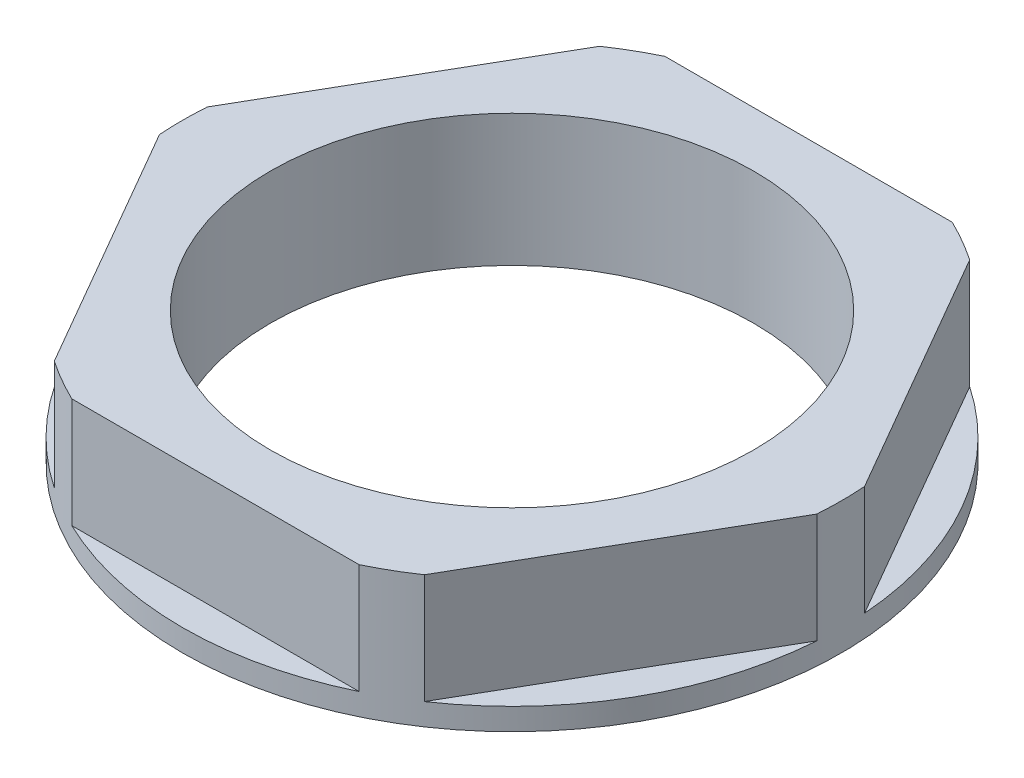
ISO-10303-21;
HEADER;
FILE_DESCRIPTION(('STEP AP214'),'2;1');
FILE_NAME('part.step','',(''),(''),'','','');
FILE_SCHEMA(('AUTOMOTIVE_DESIGN { 1 0 10303 214 1 1 1 1 }'));
ENDSEC;
DATA;
#1=APPLICATION_CONTEXT('core data for automotive mechanical design processes');
#2=APPLICATION_PROTOCOL_DEFINITION('international standard','automotive_design',2000,#1);
#3=PRODUCT_CONTEXT('',#1,'mechanical');
#4=PRODUCT('Part','Part','',(#3));
#5=PRODUCT_RELATED_PRODUCT_CATEGORY('part','',(#4));
#6=PRODUCT_DEFINITION_FORMATION('','',#4);
#7=PRODUCT_DEFINITION_CONTEXT('part definition',#1,'design');
#8=PRODUCT_DEFINITION('design','',#6,#7);
#9=PRODUCT_DEFINITION_SHAPE('','',#8);
#10=(LENGTH_UNIT() NAMED_UNIT(*) SI_UNIT(.MILLI.,.METRE.));
#11=(NAMED_UNIT(*) PLANE_ANGLE_UNIT() SI_UNIT($,.RADIAN.));
#12=(NAMED_UNIT(*) SI_UNIT($,.STERADIAN.) SOLID_ANGLE_UNIT());
#13=UNCERTAINTY_MEASURE_WITH_UNIT(LENGTH_MEASURE(1.E-05),#10,'distance_accuracy_value','');
#14=(GEOMETRIC_REPRESENTATION_CONTEXT(3) GLOBAL_UNCERTAINTY_ASSIGNED_CONTEXT((#13)) GLOBAL_UNIT_ASSIGNED_CONTEXT((#10,
#11,#12)) REPRESENTATION_CONTEXT('',''));
#15=CARTESIAN_POINT('',(0.,0.,0.));
#16=DIRECTION('',(0.,0.,1.));
#17=DIRECTION('',(1.,0.,0.));
#18=AXIS2_PLACEMENT_3D('',#15,#16,#17);
#19=CARTESIAN_POINT('',(0.,6.,0.));
#20=DIRECTION('',(0.,1.,0.));
#21=DIRECTION('',(0.,0.,1.));
#22=AXIS2_PLACEMENT_3D('',#19,#20,#21);
#23=PLANE('',#22);
#24=CARTESIAN_POINT('',(0.,6.,0.));
#25=DIRECTION('',(0.,1.,0.));
#26=DIRECTION('',(0.,0.,1.));
#27=AXIS2_PLACEMENT_3D('',#24,#25,#26);
#28=CIRCLE('',#27,11.);
#29=CARTESIAN_POINT('',(0.,6.,11.));
#30=VERTEX_POINT('',#29);
#31=EDGE_CURVE('E126',#30,#30,#28,.T.);
#32=ORIENTED_EDGE('',*,*,#31,.F.);
#33=EDGE_LOOP('',(#32));
#34=FACE_BOUND('',#33,.T.);
#35=DIRECTION('',(1.,0.,0.));
#36=VECTOR('',#35,1.);
#37=CARTESIAN_POINT('',(-7.79422863405995,6.,13.5));
#38=LINE('',#37,#36);
#39=CARTESIAN_POINT('',(-6.538348415311,6.,13.5));
#40=VERTEX_POINT('',#39);
#41=CARTESIAN_POINT('',(6.53834841531099,6.,13.5));
#42=VERTEX_POINT('',#41);
#43=EDGE_CURVE('E135',#40,#42,#38,.T.);
#44=ORIENTED_EDGE('',*,*,#43,.T.);
#45=CARTESIAN_POINT('',(0.,6.,0.));
#46=DIRECTION('',(0.,1.,0.));
#47=DIRECTION('',(0.,0.,1.));
#48=AXIS2_PLACEMENT_3D('',#45,#46,#47);
#49=CIRCLE('',#48,15.);
#50=CARTESIAN_POINT('',(8.42216874343443,6.,12.4123758264531));
#51=VERTEX_POINT('',#50);
#52=EDGE_CURVE('E47',#42,#51,#49,.T.);
#53=ORIENTED_EDGE('',*,*,#52,.T.);
#54=DIRECTION('',(0.5,0.,-0.866025403784439));
#55=VECTOR('',#54,1.);
#56=CARTESIAN_POINT('',(7.79422863405995,6.,13.5));
#57=LINE('',#56,#55);
#58=CARTESIAN_POINT('',(14.9605171587454,6.,1.08762417354694));
#59=VERTEX_POINT('',#58);
#60=EDGE_CURVE('E133',#51,#59,#57,.T.);
#61=ORIENTED_EDGE('',*,*,#60,.T.);
#62=CARTESIAN_POINT('',(14.9605171587454,6.,-1.08762417354694));
#63=VERTEX_POINT('',#62);
#64=EDGE_CURVE('E137',#59,#63,#49,.T.);
#65=ORIENTED_EDGE('',*,*,#64,.T.);
#66=DIRECTION('',(-0.5,0.,-0.866025403784438));
#67=VECTOR('',#66,1.);
#68=CARTESIAN_POINT('',(15.5884572681199,6.,0.));
#69=LINE('',#68,#67);
#70=CARTESIAN_POINT('',(8.42216874343441,6.,-12.4123758264531));
#71=VERTEX_POINT('',#70);
#72=EDGE_CURVE('E142',#63,#71,#69,.T.);
#73=ORIENTED_EDGE('',*,*,#72,.T.);
#74=CARTESIAN_POINT('',(6.53834841531098,6.,-13.5));
#75=VERTEX_POINT('',#74);
#76=EDGE_CURVE('E385',#71,#75,#49,.T.);
#77=ORIENTED_EDGE('',*,*,#76,.T.);
#78=DIRECTION('',(-1.,0.,0.));
#79=VECTOR('',#78,1.);
#80=CARTESIAN_POINT('',(7.79422863405994,6.,-13.5));
#81=LINE('',#80,#79);
#82=CARTESIAN_POINT('',(-6.53834841531098,6.,-13.5));
#83=VERTEX_POINT('',#82);
#84=EDGE_CURVE('E145',#75,#83,#81,.T.);
#85=ORIENTED_EDGE('',*,*,#84,.T.);
#86=CARTESIAN_POINT('',(-8.42216874343443,6.,-12.4123758264531));
#87=VERTEX_POINT('',#86);
#88=EDGE_CURVE('E381',#83,#87,#49,.T.);
#89=ORIENTED_EDGE('',*,*,#88,.T.);
#90=DIRECTION('',(-0.5,0.,0.866025403784439));
#91=VECTOR('',#90,1.);
#92=CARTESIAN_POINT('',(-7.79422863405995,6.,-13.5));
#93=LINE('',#92,#91);
#94=CARTESIAN_POINT('',(-14.9605171587454,6.,-1.08762417354695));
#95=VERTEX_POINT('',#94);
#96=EDGE_CURVE('E152',#87,#95,#93,.T.);
#97=ORIENTED_EDGE('',*,*,#96,.T.);
#98=CARTESIAN_POINT('',(-14.9605171587454,6.,1.08762417354696));
#99=VERTEX_POINT('',#98);
#100=EDGE_CURVE('E386',#95,#99,#49,.T.);
#101=ORIENTED_EDGE('',*,*,#100,.T.);
#102=DIRECTION('',(0.5,0.,0.866025403784439));
#103=VECTOR('',#102,1.);
#104=CARTESIAN_POINT('',(-15.5884572681199,6.,0.));
#105=LINE('',#104,#103);
#106=CARTESIAN_POINT('',(-8.42216874343443,6.,12.4123758264531));
#107=VERTEX_POINT('',#106);
#108=EDGE_CURVE('E155',#99,#107,#105,.T.);
#109=ORIENTED_EDGE('',*,*,#108,.T.);
#110=EDGE_CURVE('E139',#107,#40,#49,.T.);
#111=ORIENTED_EDGE('',*,*,#110,.T.);
#112=EDGE_LOOP('',(#44,#53,#61,#65,#73,#77,#85,#89,#97,#101,#109,#111));
#113=FACE_BOUND('',#112,.T.);
#114=ADVANCED_FACE('F32',(#34,#113),#23,.T.);
#115=CARTESIAN_POINT('',(7.79422863405995,6.,13.5));
#116=DIRECTION('',(-0.866025403784439,0.,-0.5));
#117=DIRECTION('',(-0.5,0.,0.866025403784439));
#118=AXIS2_PLACEMENT_3D('',#115,#116,#117);
#119=PLANE('',#118);
#120=DIRECTION('',(0.,1.,0.));
#121=VECTOR('',#120,1.);
#122=CARTESIAN_POINT('',(8.42216874343443,0.,12.4123758264531));
#123=LINE('',#122,#121);
#124=CARTESIAN_POINT('',(8.42216874343443,1.,12.4123758264531));
#125=VERTEX_POINT('',#124);
#126=EDGE_CURVE('E118',#125,#51,#123,.T.);
#127=ORIENTED_EDGE('',*,*,#126,.F.);
#128=DIRECTION('',(0.5,0.,-0.866025403784439));
#129=VECTOR('',#128,1.);
#130=CARTESIAN_POINT('',(7.79422863405995,1.,13.5));
#131=LINE('',#130,#129);
#132=CARTESIAN_POINT('',(14.9605171587454,1.,1.08762417354694));
#133=VERTEX_POINT('',#132);
#134=EDGE_CURVE('E160',#125,#133,#131,.T.);
#135=ORIENTED_EDGE('',*,*,#134,.T.);
#136=DIRECTION('',(0.,1.,0.));
#137=VECTOR('',#136,1.);
#138=CARTESIAN_POINT('',(14.9605171587454,0.,1.08762417354694));
#139=LINE('',#138,#137);
#140=EDGE_CURVE('E136',#59,#133,#139,.F.);
#141=ORIENTED_EDGE('',*,*,#140,.F.);
#142=ORIENTED_EDGE('',*,*,#60,.F.);
#143=EDGE_LOOP('',(#127,#135,#141,#142));
#144=FACE_BOUND('',#143,.T.);
#145=ADVANCED_FACE('F141',(#144),#119,.F.);
#146=CARTESIAN_POINT('',(15.5884572681199,6.,0.));
#147=DIRECTION('',(-0.866025403784438,0.,0.5));
#148=DIRECTION('',(0.5,0.,0.866025403784439));
#149=AXIS2_PLACEMENT_3D('',#146,#147,#148);
#150=PLANE('',#149);
#151=DIRECTION('',(0.,1.,0.));
#152=VECTOR('',#151,1.);
#153=CARTESIAN_POINT('',(14.9605171587454,0.,-1.08762417354694));
#154=LINE('',#153,#152);
#155=CARTESIAN_POINT('',(14.9605171587454,1.,-1.08762417354695));
#156=VERTEX_POINT('',#155);
#157=EDGE_CURVE('E127',#156,#63,#154,.T.);
#158=ORIENTED_EDGE('',*,*,#157,.F.);
#159=DIRECTION('',(-0.5,0.,-0.866025403784438));
#160=VECTOR('',#159,1.);
#161=CARTESIAN_POINT('',(15.5884572681199,1.,0.));
#162=LINE('',#161,#160);
#163=CARTESIAN_POINT('',(8.42216874343442,1.,-12.4123758264531));
#164=VERTEX_POINT('',#163);
#165=EDGE_CURVE('E163',#156,#164,#162,.T.);
#166=ORIENTED_EDGE('',*,*,#165,.T.);
#167=DIRECTION('',(0.,1.,0.));
#168=VECTOR('',#167,1.);
#169=CARTESIAN_POINT('',(8.42216874343442,0.,-12.4123758264531));
#170=LINE('',#169,#168);
#171=EDGE_CURVE('E347',#71,#164,#170,.F.);
#172=ORIENTED_EDGE('',*,*,#171,.F.);
#173=ORIENTED_EDGE('',*,*,#72,.F.);
#174=EDGE_LOOP('',(#158,#166,#172,#173));
#175=FACE_BOUND('',#174,.T.);
#176=ADVANCED_FACE('F208',(#175),#150,.F.);
#177=CARTESIAN_POINT('',(7.79422863405994,6.,-13.5));
#178=DIRECTION('',(0.,0.,1.));
#179=DIRECTION('',(1.,0.,0.));
#180=AXIS2_PLACEMENT_3D('',#177,#178,#179);
#181=PLANE('',#180);
#182=DIRECTION('',(0.,1.,0.));
#183=VECTOR('',#182,1.);
#184=CARTESIAN_POINT('',(6.53834841531098,0.,-13.5));
#185=LINE('',#184,#183);
#186=CARTESIAN_POINT('',(6.53834841531099,1.,-13.5));
#187=VERTEX_POINT('',#186);
#188=EDGE_CURVE('E375',#187,#75,#185,.T.);
#189=ORIENTED_EDGE('',*,*,#188,.F.);
#190=DIRECTION('',(-1.,0.,0.));
#191=VECTOR('',#190,1.);
#192=CARTESIAN_POINT('',(7.79422863405994,1.,-13.5));
#193=LINE('',#192,#191);
#194=CARTESIAN_POINT('',(-6.53834841531099,1.,-13.5));
#195=VERTEX_POINT('',#194);
#196=EDGE_CURVE('E166',#187,#195,#193,.T.);
#197=ORIENTED_EDGE('',*,*,#196,.T.);
#198=DIRECTION('',(0.,1.,0.));
#199=VECTOR('',#198,1.);
#200=CARTESIAN_POINT('',(-6.53834841531098,0.,-13.5));
#201=LINE('',#200,#199);
#202=EDGE_CURVE('E377',#83,#195,#201,.F.);
#203=ORIENTED_EDGE('',*,*,#202,.F.);
#204=ORIENTED_EDGE('',*,*,#84,.F.);
#205=EDGE_LOOP('',(#189,#197,#203,#204));
#206=FACE_BOUND('',#205,.T.);
#207=ADVANCED_FACE('F303',(#206),#181,.F.);
#208=CARTESIAN_POINT('',(-7.79422863405995,6.,-13.5));
#209=DIRECTION('',(0.866025403784439,0.,0.5));
#210=DIRECTION('',(0.5,0.,-0.866025403784439));
#211=AXIS2_PLACEMENT_3D('',#208,#209,#210);
#212=PLANE('',#211);
#213=DIRECTION('',(0.,1.,0.));
#214=VECTOR('',#213,1.);
#215=CARTESIAN_POINT('',(-8.42216874343443,0.,-12.4123758264531));
#216=LINE('',#215,#214);
#217=CARTESIAN_POINT('',(-8.42216874343443,1.,-12.4123758264531));
#218=VERTEX_POINT('',#217);
#219=EDGE_CURVE('E373',#218,#87,#216,.T.);
#220=ORIENTED_EDGE('',*,*,#219,.F.);
#221=DIRECTION('',(-0.5,0.,0.866025403784439));
#222=VECTOR('',#221,1.);
#223=CARTESIAN_POINT('',(-7.79422863405995,1.,-13.5));
#224=LINE('',#223,#222);
#225=CARTESIAN_POINT('',(-14.9605171587454,1.,-1.08762417354695));
#226=VERTEX_POINT('',#225);
#227=EDGE_CURVE('E169',#218,#226,#224,.T.);
#228=ORIENTED_EDGE('',*,*,#227,.T.);
#229=DIRECTION('',(0.,1.,0.));
#230=VECTOR('',#229,1.);
#231=CARTESIAN_POINT('',(-14.9605171587454,0.,-1.08762417354695));
#232=LINE('',#231,#230);
#233=EDGE_CURVE('E368',#95,#226,#232,.F.);
#234=ORIENTED_EDGE('',*,*,#233,.F.);
#235=ORIENTED_EDGE('',*,*,#96,.F.);
#236=EDGE_LOOP('',(#220,#228,#234,#235));
#237=FACE_BOUND('',#236,.T.);
#238=ADVANCED_FACE('F199',(#237),#212,.F.);
#239=CARTESIAN_POINT('',(-15.5884572681199,6.,0.));
#240=DIRECTION('',(0.866025403784439,0.,-0.5));
#241=DIRECTION('',(-0.5,0.,-0.866025403784439));
#242=AXIS2_PLACEMENT_3D('',#239,#240,#241);
#243=PLANE('',#242);
#244=DIRECTION('',(0.,1.,0.));
#245=VECTOR('',#244,1.);
#246=CARTESIAN_POINT('',(-14.9605171587454,0.,1.08762417354696));
#247=LINE('',#246,#245);
#248=CARTESIAN_POINT('',(-14.9605171587454,1.,1.08762417354696));
#249=VERTEX_POINT('',#248);
#250=EDGE_CURVE('E365',#249,#99,#247,.T.);
#251=ORIENTED_EDGE('',*,*,#250,.F.);
#252=DIRECTION('',(0.5,0.,0.866025403784439));
#253=VECTOR('',#252,1.);
#254=CARTESIAN_POINT('',(-15.5884572681199,1.,0.));
#255=LINE('',#254,#253);
#256=CARTESIAN_POINT('',(-8.42216874343443,1.,12.4123758264531));
#257=VERTEX_POINT('',#256);
#258=EDGE_CURVE('E172',#249,#257,#255,.T.);
#259=ORIENTED_EDGE('',*,*,#258,.T.);
#260=DIRECTION('',(0.,1.,0.));
#261=VECTOR('',#260,1.);
#262=CARTESIAN_POINT('',(-8.42216874343443,0.,12.4123758264531));
#263=LINE('',#262,#261);
#264=EDGE_CURVE('E364',#107,#257,#263,.F.);
#265=ORIENTED_EDGE('',*,*,#264,.F.);
#266=ORIENTED_EDGE('',*,*,#108,.F.);
#267=EDGE_LOOP('',(#251,#259,#265,#266));
#268=FACE_BOUND('',#267,.T.);
#269=ADVANCED_FACE('F190',(#268),#243,.F.);
#270=CARTESIAN_POINT('',(-7.79422863405995,6.,13.5));
#271=DIRECTION('',(0.,0.,-1.));
#272=DIRECTION('',(-1.,0.,0.));
#273=AXIS2_PLACEMENT_3D('',#270,#271,#272);
#274=PLANE('',#273);
#275=DIRECTION('',(0.,1.,0.));
#276=VECTOR('',#275,1.);
#277=CARTESIAN_POINT('',(-6.538348415311,0.,13.5));
#278=LINE('',#277,#276);
#279=CARTESIAN_POINT('',(-6.538348415311,1.,13.5));
#280=VERTEX_POINT('',#279);
#281=EDGE_CURVE('E11',#280,#40,#278,.T.);
#282=ORIENTED_EDGE('',*,*,#281,.F.);
#283=DIRECTION('',(1.,0.,0.));
#284=VECTOR('',#283,1.);
#285=CARTESIAN_POINT('',(-7.79422863405995,1.,13.5));
#286=LINE('',#285,#284);
#287=CARTESIAN_POINT('',(6.538348415311,1.,13.5));
#288=VERTEX_POINT('',#287);
#289=EDGE_CURVE('E162',#280,#288,#286,.T.);
#290=ORIENTED_EDGE('',*,*,#289,.T.);
#291=DIRECTION('',(0.,1.,0.));
#292=VECTOR('',#291,1.);
#293=CARTESIAN_POINT('',(6.538348415311,0.,13.5));
#294=LINE('',#293,#292);
#295=EDGE_CURVE('E40',#42,#288,#294,.F.);
#296=ORIENTED_EDGE('',*,*,#295,.F.);
#297=ORIENTED_EDGE('',*,*,#43,.F.);
#298=EDGE_LOOP('',(#282,#290,#296,#297));
#299=FACE_BOUND('',#298,.T.);
#300=ADVANCED_FACE('F187',(#299),#274,.F.);
#301=CARTESIAN_POINT('',(0.,1.,0.));
#302=DIRECTION('',(0.,1.,0.));
#303=DIRECTION('',(0.,0.,1.));
#304=AXIS2_PLACEMENT_3D('',#301,#302,#303);
#305=PLANE('',#304);
#306=ORIENTED_EDGE('',*,*,#134,.F.);
#307=CARTESIAN_POINT('',(0.,1.,0.));
#308=DIRECTION('',(0.,1.,0.));
#309=DIRECTION('',(0.,0.,1.));
#310=AXIS2_PLACEMENT_3D('',#307,#308,#309);
#311=CIRCLE('',#310,15.);
#312=EDGE_CURVE('E121',#125,#133,#311,.T.);
#313=ORIENTED_EDGE('',*,*,#312,.T.);
#314=EDGE_LOOP('',(#306,#313));
#315=FACE_BOUND('',#314,.T.);
#316=ADVANCED_FACE('F189',(#315),#305,.T.);
#317=ORIENTED_EDGE('',*,*,#289,.F.);
#318=EDGE_CURVE('E179',#280,#288,#311,.T.);
#319=ORIENTED_EDGE('',*,*,#318,.T.);
#320=EDGE_LOOP('',(#317,#319));
#321=FACE_BOUND('',#320,.T.);
#322=ADVANCED_FACE('F186',(#321),#305,.T.);
#323=ORIENTED_EDGE('',*,*,#258,.F.);
#324=EDGE_CURVE('E182',#249,#257,#311,.T.);
#325=ORIENTED_EDGE('',*,*,#324,.T.);
#326=EDGE_LOOP('',(#323,#325));
#327=FACE_BOUND('',#326,.T.);
#328=ADVANCED_FACE('F262',(#327),#305,.T.);
#329=ORIENTED_EDGE('',*,*,#227,.F.);
#330=EDGE_CURVE('E353',#218,#226,#311,.T.);
#331=ORIENTED_EDGE('',*,*,#330,.T.);
#332=EDGE_LOOP('',(#329,#331));
#333=FACE_BOUND('',#332,.T.);
#334=ADVANCED_FACE('F252',(#333),#305,.T.);
#335=ORIENTED_EDGE('',*,*,#196,.F.);
#336=EDGE_CURVE('E351',#187,#195,#311,.T.);
#337=ORIENTED_EDGE('',*,*,#336,.T.);
#338=EDGE_LOOP('',(#335,#337));
#339=FACE_BOUND('',#338,.T.);
#340=ADVANCED_FACE('F223',(#339),#305,.T.);
#341=ORIENTED_EDGE('',*,*,#165,.F.);
#342=EDGE_CURVE('E350',#156,#164,#311,.T.);
#343=ORIENTED_EDGE('',*,*,#342,.T.);
#344=EDGE_LOOP('',(#341,#343));
#345=FACE_BOUND('',#344,.T.);
#346=ADVANCED_FACE('F198',(#345),#305,.T.);
#347=CARTESIAN_POINT('',(0.,0.,0.));
#348=DIRECTION('',(0.,1.,0.));
#349=DIRECTION('',(0.,0.,1.));
#350=AXIS2_PLACEMENT_3D('',#347,#348,#349);
#351=PLANE('',#350);
#352=CARTESIAN_POINT('',(0.,0.,0.));
#353=DIRECTION('',(0.,1.,0.));
#354=DIRECTION('',(0.,0.,1.));
#355=AXIS2_PLACEMENT_3D('',#352,#353,#354);
#356=CIRCLE('',#355,15.);
#357=CARTESIAN_POINT('',(0.,0.,15.));
#358=VERTEX_POINT('',#357);
#359=EDGE_CURVE('E178',#358,#358,#356,.T.);
#360=ORIENTED_EDGE('',*,*,#359,.F.);
#361=EDGE_LOOP('',(#360));
#362=FACE_BOUND('',#361,.T.);
#363=CARTESIAN_POINT('',(0.,0.,0.));
#364=DIRECTION('',(0.,1.,0.));
#365=DIRECTION('',(0.,0.,1.));
#366=AXIS2_PLACEMENT_3D('',#363,#364,#365);
#367=CIRCLE('',#366,11.);
#368=CARTESIAN_POINT('',(0.,0.,11.));
#369=VERTEX_POINT('',#368);
#370=EDGE_CURVE('E159',#369,#369,#367,.T.);
#371=ORIENTED_EDGE('',*,*,#370,.T.);
#372=EDGE_LOOP('',(#371));
#373=FACE_BOUND('',#372,.T.);
#374=ADVANCED_FACE('F219',(#362,#373),#351,.F.);
#375=CARTESIAN_POINT('',(0.,1.,0.));
#376=DIRECTION('',(0.,-1.,0.));
#377=DIRECTION('',(0.,0.,-1.));
#378=AXIS2_PLACEMENT_3D('',#375,#376,#377);
#379=CYLINDRICAL_SURFACE('',#378,15.);
#380=ORIENTED_EDGE('',*,*,#312,.F.);
#381=ORIENTED_EDGE('',*,*,#126,.T.);
#382=ORIENTED_EDGE('',*,*,#52,.F.);
#383=ORIENTED_EDGE('',*,*,#295,.T.);
#384=ORIENTED_EDGE('',*,*,#318,.F.);
#385=ORIENTED_EDGE('',*,*,#281,.T.);
#386=ORIENTED_EDGE('',*,*,#110,.F.);
#387=ORIENTED_EDGE('',*,*,#264,.T.);
#388=ORIENTED_EDGE('',*,*,#324,.F.);
#389=ORIENTED_EDGE('',*,*,#250,.T.);
#390=ORIENTED_EDGE('',*,*,#100,.F.);
#391=ORIENTED_EDGE('',*,*,#233,.T.);
#392=ORIENTED_EDGE('',*,*,#330,.F.);
#393=ORIENTED_EDGE('',*,*,#219,.T.);
#394=ORIENTED_EDGE('',*,*,#88,.F.);
#395=ORIENTED_EDGE('',*,*,#202,.T.);
#396=ORIENTED_EDGE('',*,*,#336,.F.);
#397=ORIENTED_EDGE('',*,*,#188,.T.);
#398=ORIENTED_EDGE('',*,*,#76,.F.);
#399=ORIENTED_EDGE('',*,*,#171,.T.);
#400=ORIENTED_EDGE('',*,*,#342,.F.);
#401=ORIENTED_EDGE('',*,*,#157,.T.);
#402=ORIENTED_EDGE('',*,*,#64,.F.);
#403=ORIENTED_EDGE('',*,*,#140,.T.);
#404=EDGE_LOOP('',(#380,#381,#382,#383,#384,#385,#386,#387,#388,#389,#390,#391,#392,#393,#394,
#395,#396,#397,#398,#399,#400,#401,#402,#403));
#405=FACE_BOUND('',#404,.T.);
#406=ORIENTED_EDGE('',*,*,#359,.T.);
#407=EDGE_LOOP('',(#406));
#408=FACE_BOUND('',#407,.T.);
#409=ADVANCED_FACE('F34',(#405,#408),#379,.T.);
#410=CARTESIAN_POINT('',(0.,1.,0.));
#411=DIRECTION('',(0.,-1.,0.));
#412=DIRECTION('',(0.,0.,-1.));
#413=AXIS2_PLACEMENT_3D('',#410,#411,#412);
#414=CYLINDRICAL_SURFACE('',#413,11.);
#415=ORIENTED_EDGE('',*,*,#370,.F.);
#416=EDGE_LOOP('',(#415));
#417=FACE_BOUND('',#416,.T.);
#418=ORIENTED_EDGE('',*,*,#31,.T.);
#419=EDGE_LOOP('',(#418));
#420=FACE_BOUND('',#419,.T.);
#421=ADVANCED_FACE('F212',(#417,#420),#414,.F.);
#422=CLOSED_SHELL('',(#114,#145,#176,#207,#238,#269,#300,#316,#322,#328,#334,#340,#346,#374,
#409,#421));
#423=MANIFOLD_SOLID_BREP('B2',#422);
#424=ADVANCED_BREP_SHAPE_REPRESENTATION('',(#18,#423),#14);
#425=SHAPE_DEFINITION_REPRESENTATION(#9,#424);
ENDSEC;
END-ISO-10303-21;
